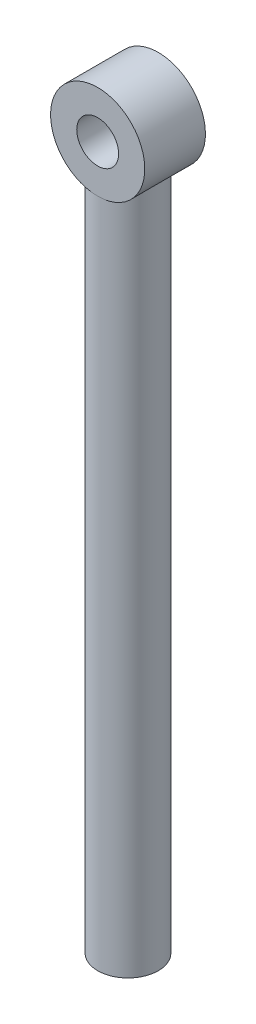
ISO-10303-21;
HEADER;
FILE_DESCRIPTION(('STEP AP214'),'2;1');
FILE_NAME('part.step','',(''),(''),'','','');
FILE_SCHEMA(('AUTOMOTIVE_DESIGN { 1 0 10303 214 1 1 1 1 }'));
ENDSEC;
DATA;
#1=APPLICATION_CONTEXT('core data for automotive mechanical design processes');
#2=APPLICATION_PROTOCOL_DEFINITION('international standard','automotive_design',2000,#1);
#3=PRODUCT_CONTEXT('',#1,'mechanical');
#4=PRODUCT('Part','Part','',(#3));
#5=PRODUCT_RELATED_PRODUCT_CATEGORY('part','',(#4));
#6=PRODUCT_DEFINITION_FORMATION('','',#4);
#7=PRODUCT_DEFINITION_CONTEXT('part definition',#1,'design');
#8=PRODUCT_DEFINITION('design','',#6,#7);
#9=PRODUCT_DEFINITION_SHAPE('','',#8);
#10=(LENGTH_UNIT() NAMED_UNIT(*) SI_UNIT(.MILLI.,.METRE.));
#11=(NAMED_UNIT(*) PLANE_ANGLE_UNIT() SI_UNIT($,.RADIAN.));
#12=(NAMED_UNIT(*) SI_UNIT($,.STERADIAN.) SOLID_ANGLE_UNIT());
#13=UNCERTAINTY_MEASURE_WITH_UNIT(LENGTH_MEASURE(1.E-05),#10,'distance_accuracy_value','');
#14=(GEOMETRIC_REPRESENTATION_CONTEXT(3) GLOBAL_UNCERTAINTY_ASSIGNED_CONTEXT((#13)) GLOBAL_UNIT_ASSIGNED_CONTEXT((#10,
#11,#12)) REPRESENTATION_CONTEXT('',''));
#15=CARTESIAN_POINT('',(0.,0.,0.));
#16=DIRECTION('',(0.,0.,1.));
#17=DIRECTION('',(1.,0.,0.));
#18=AXIS2_PLACEMENT_3D('',#15,#16,#17);
#19=CARTESIAN_POINT('',(0.,137.19,-6.));
#20=DIRECTION('',(0.,0.,1.));
#21=DIRECTION('',(1.,0.,0.));
#22=AXIS2_PLACEMENT_3D('',#19,#20,#21);
#23=CYLINDRICAL_SURFACE('',#22,9.);
#24=CARTESIAN_POINT('',(0.,137.19,-5.795));
#25=DIRECTION('',(0.,0.,1.));
#26=DIRECTION('',(1.,0.,0.));
#27=AXIS2_PLACEMENT_3D('',#24,#25,#26);
#28=CIRCLE('',#27,9.);
#29=CARTESIAN_POINT('',(0.,128.19,-5.795));
#30=VERTEX_POINT('',#29);
#31=EDGE_CURVE('E64',#30,#30,#28,.F.);
#32=ORIENTED_EDGE('',*,*,#31,.F.);
#33=CARTESIAN_POINT('',(0.,128.19,-5.795));
#34=CARTESIAN_POINT('',(0.146566460211935,128.189996163815,-5.79500406610965));
#35=CARTESIAN_POINT('',(0.293094389436088,128.193585808997,-5.78943519676194));
#36=CARTESIAN_POINT('',(0.585010912628849,128.207845530778,-5.76725252388943));
#37=CARTESIAN_POINT('',(0.730399271779798,128.218517029756,-5.75063650155872));
#38=CARTESIAN_POINT('',(1.01893791146239,128.246689656394,-5.70658477809815));
#39=CARTESIAN_POINT('',(1.16208673682949,128.264195047201,-5.67914232306495));
#40=CARTESIAN_POINT('',(1.44508563906381,128.305621006286,-5.61380911613113));
#41=CARTESIAN_POINT('',(1.58493432150189,128.329544235336,-5.57591403048929));
#42=CARTESIAN_POINT('',(1.85965891551648,128.383119292647,-5.49038065346297));
#43=CARTESIAN_POINT('',(1.99455697454925,128.412740565332,-5.44279425490061));
#44=CARTESIAN_POINT('',(2.25943120744945,128.477159818797,-5.33828568017174));
#45=CARTESIAN_POINT('',(2.38940544947583,128.511959805568,-5.28135988548072));
#46=CARTESIAN_POINT('',(2.77087229348116,128.623073537936,-5.09743696545987));
#47=CARTESIAN_POINT('',(3.01416818837551,128.706153610186,-4.95721239249815));
#48=CARTESIAN_POINT('',(3.49390709466027,128.89155234267,-4.63307476649679));
#49=CARTESIAN_POINT('',(3.72814284508117,128.994891061144,-4.4465179766744));
#50=CARTESIAN_POINT('',(4.16423018226008,129.207641650011,-4.04103456261219));
#51=CARTESIAN_POINT('',(4.36603636907035,129.317061750758,-3.82206336896974));
#52=CARTESIAN_POINT('',(4.65565171652341,129.486759145333,-3.45484376078352));
#53=CARTESIAN_POINT('',(4.75535315040896,129.548078058326,-3.31630026094598));
#54=CARTESIAN_POINT('',(4.94265359664025,129.66786360827,-3.03009754810605));
#55=CARTESIAN_POINT('',(5.03025012816019,129.726329658961,-2.88243647545778));
#56=CARTESIAN_POINT('',(5.27357790009867,129.894243505644,-2.42684691303729));
#57=CARTESIAN_POINT('',(5.41043168823586,129.996566846101,-2.10557600934063));
#58=CARTESIAN_POINT('',(5.59624716744369,130.140742319172,-1.52628668717239));
#59=CARTESIAN_POINT('',(5.65899988913766,130.19147565492,-1.27491095137898));
#60=CARTESIAN_POINT('',(5.72762959496277,130.247732873605,-0.890644735579731));
#61=CARTESIAN_POINT('',(5.74625443686519,130.263176429205,-0.761396842354587));
#62=CARTESIAN_POINT('',(5.77476088146397,130.286920966589,-0.501261478201259));
#63=CARTESIAN_POINT('',(5.78464239386718,130.295221874611,-0.370373990354992));
#64=CARTESIAN_POINT('',(5.79549992328461,130.304346205593,-0.107542448493395));
#65=CARTESIAN_POINT('',(5.79644682402809,130.305145181081,0.0244036584390873));
#66=CARTESIAN_POINT('',(5.78934531283242,130.299172600946,0.287879164456985));
#67=CARTESIAN_POINT('',(5.78129685729199,130.292401008626,0.419408561519473));
#68=CARTESIAN_POINT('',(5.75633576327491,130.271556377372,0.681106551360294));
#69=CARTESIAN_POINT('',(5.7394184860462,130.257479517526,0.811274395617237));
#70=CARTESIAN_POINT('',(5.69699384065389,130.222575407119,1.06930347172042));
#71=CARTESIAN_POINT('',(5.67148289186515,130.201745342916,1.19716371865238));
#72=CARTESIAN_POINT('',(5.58448687493165,130.131744103368,1.56795139527387));
#73=CARTESIAN_POINT('',(5.51166176449319,130.074278226842,1.80675731058647));
#74=CARTESIAN_POINT('',(5.33805498475075,129.943143787006,2.26899373419825));
#75=CARTESIAN_POINT('',(5.23726406465388,129.869469863919,2.49241912420707));
#76=CARTESIAN_POINT('',(4.98805793438041,129.696904478514,2.96405721561836));
#77=CARTESIAN_POINT('',(4.83418896469323,129.595896877173,3.20861070641109));
#78=CARTESIAN_POINT('',(4.49291913384385,129.389134642643,3.6712987863816));
#79=CARTESIAN_POINT('',(4.30547822547128,129.283374454323,3.88940129587287));
#80=CARTESIAN_POINT('',(3.98202648069638,129.117709856851,4.21362176794068));
#81=CARTESIAN_POINT('',(3.85602104684325,129.056616720364,4.32926141648315));
#82=CARTESIAN_POINT('',(3.59349471090576,128.937269799221,4.54952312783881));
#83=CARTESIAN_POINT('',(3.45697725038741,128.879015095395,4.65414877023152));
#84=CARTESIAN_POINT('',(3.17404040075722,128.766899781425,4.8515182210462));
#85=CARTESIAN_POINT('',(3.02762695239219,128.713036577089,4.9442690630173));
#86=CARTESIAN_POINT('',(2.72554188804598,128.611141885818,5.11700065329541));
#87=CARTESIAN_POINT('',(2.56987285898514,128.563108780689,5.19698494701825));
#88=CARTESIAN_POINT('',(2.28192041908408,128.483075225029,5.32866999781728));
#89=CARTESIAN_POINT('',(2.15111715814147,128.449783998009,5.38283451004325));
#90=CARTESIAN_POINT('',(1.88480582897197,128.38851352913,5.48176054202909));
#91=CARTESIAN_POINT('',(1.74929869169749,128.360533243185,5.52652391016118));
#92=CARTESIAN_POINT('',(1.47441579298938,128.310495444559,5.60612020221522));
#93=CARTESIAN_POINT('',(1.33504246182657,128.288434300225,5.64095921597647));
#94=CARTESIAN_POINT('',(1.05324965439295,128.250711999137,5.70030000721156));
#95=CARTESIAN_POINT('',(0.910830122929085,128.235050958447,5.72480159721818));
#96=CARTESIAN_POINT('',(0.623471195373022,128.210459371977,5.76319299342244));
#97=CARTESIAN_POINT('',(0.478524677524407,128.201552785911,5.77704502538261));
#98=CARTESIAN_POINT('',(0.18773672365014,128.190782114213,5.79378881428976));
#99=CARTESIAN_POINT('',(0.0418952873021302,128.188918031118,5.79668056728851));
#100=CARTESIAN_POINT('',(-0.249514474181884,128.192279389996,5.79145967493547));
#101=CARTESIAN_POINT('',(-0.395082786184961,128.197505164552,5.78334651334761));
#102=CARTESIAN_POINT('',(-0.684774347379441,128.214915461171,5.75623790598855));
#103=CARTESIAN_POINT('',(-0.828897637023239,128.227099787877,5.7372427657211));
#104=CARTESIAN_POINT('',(-1.10662861507657,128.257263791365,5.69000116931099));
#105=CARTESIAN_POINT('',(-1.2403740587641,128.274881807033,5.66233062568513));
#106=CARTESIAN_POINT('',(-1.50479977836985,128.315682546303,5.59787011058351));
#107=CARTESIAN_POINT('',(-1.6354789880285,128.338867175069,5.56107701678627));
#108=CARTESIAN_POINT('',(-2.02170039666333,128.416092062372,5.43761627521842));
#109=CARTESIAN_POINT('',(-2.27164943812808,128.477828652185,5.33782845512569));
#110=CARTESIAN_POINT('',(-2.769023218433,128.622357482491,5.09865137517513));
#111=CARTESIAN_POINT('',(-3.0149523429355,128.70635138233,4.95691629383646));
#112=CARTESIAN_POINT('',(-3.48068386606001,128.886549095247,4.64177165728695));
#113=CARTESIAN_POINT('',(-3.70046638007826,128.982762087477,4.46833824639162));
#114=CARTESIAN_POINT('',(-4.14327827445386,129.196100193613,4.06428147800318));
#115=CARTESIAN_POINT('',(-4.36161191645123,129.31416622984,3.82896499997568));
#116=CARTESIAN_POINT('',(-4.65825937707268,129.488450166968,3.45084522523887));
#117=CARTESIAN_POINT('',(-4.75204192812729,129.546105953626,3.3205374022702));
#118=CARTESIAN_POINT('',(-4.92890625459751,129.658939605373,3.05185165382301));
#119=CARTESIAN_POINT('',(-5.01198835787395,129.714117546347,2.91347397579301));
#120=CARTESIAN_POINT('',(-5.22418731627669,129.859617078838,2.52371495394658));
#121=CARTESIAN_POINT('',(-5.34200281436601,129.945807337544,2.26433306507069));
#122=CARTESIAN_POINT('',(-5.49010663671462,130.058198642925,1.86046971947333));
#123=CARTESIAN_POINT('',(-5.53470213127286,130.092844532,1.72339564306661));
#124=CARTESIAN_POINT('',(-5.61384828629813,130.155282853292,1.44487259330761));
#125=CARTESIAN_POINT('',(-5.64840400622538,130.183078736435,1.30342586341955));
#126=CARTESIAN_POINT('',(-5.70723337074461,130.230908944326,1.01553987129334));
#127=CARTESIAN_POINT('',(-5.73139687710968,130.250859946452,0.869064085271767));
#128=CARTESIAN_POINT('',(-5.76844866367442,130.281629354826,0.5737292258866));
#129=CARTESIAN_POINT('',(-5.78133726870309,130.292448024174,0.424870221309162));
#130=CARTESIAN_POINT('',(-5.79554894007888,130.304384498585,0.126315519175613));
#131=CARTESIAN_POINT('',(-5.79688028543933,130.305509247858,-0.023379502567964));
#132=CARTESIAN_POINT('',(-5.7879674436291,130.298014311043,-0.322168026546469));
#133=CARTESIAN_POINT('',(-5.77772428201023,130.289395488277,-0.471261580899439));
#134=CARTESIAN_POINT('',(-5.74830234796798,130.26487764578,-0.745008149542937));
#135=CARTESIAN_POINT('',(-5.73070592192043,130.250274054941,-0.869953033347393));
#136=CARTESIAN_POINT('',(-5.68760071418632,130.214903863287,-1.11760163766319));
#137=CARTESIAN_POINT('',(-5.66208969431247,130.194135519197,-1.24030471380161));
#138=CARTESIAN_POINT('',(-5.57413938332963,130.123551861374,-1.60412406148585));
#139=CARTESIAN_POINT('',(-5.50028402349704,130.065458970112,-1.8409397968097));
#140=CARTESIAN_POINT('',(-5.29476019612672,129.910780040999,-2.37833899313743));
#141=CARTESIAN_POINT('',(-5.15194301208655,129.807827001076,-2.67282401118883));
#142=CARTESIAN_POINT('',(-4.90475790834357,129.643262523096,-3.09057838943878));
#143=CARTESIAN_POINT('',(-4.8167462253627,129.586645707605,-3.22597992778944));
#144=CARTESIAN_POINT('',(-4.63013794186146,129.471592659449,-3.48851778504828));
#145=CARTESIAN_POINT('',(-4.53154220738867,129.413156575923,-3.61565477884397));
#146=CARTESIAN_POINT('',(-4.3228759733769,129.29523593493,-3.86280651430476));
#147=CARTESIAN_POINT('',(-4.2126732493201,129.235747608019,-3.98270751350078));
#148=CARTESIAN_POINT('',(-3.98226111384576,129.117928709243,-4.21309328840516));
#149=CARTESIAN_POINT('',(-3.86205230579105,129.059598067832,-4.32357863106191));
#150=CARTESIAN_POINT('',(-3.6120865825215,128.945505050599,-4.5344881944535));
#151=CARTESIAN_POINT('',(-3.48233466942049,128.88974135386,-4.6349176218198));
#152=CARTESIAN_POINT('',(-3.21375810984177,128.782106698474,-4.82502114696768));
#153=CARTESIAN_POINT('',(-3.07493881220026,128.730233482951,-4.91470149865284));
#154=CARTESIAN_POINT('',(-2.80659840266023,128.637774446614,-5.07209211762957));
#155=CARTESIAN_POINT('',(-2.67807262086438,128.596587471748,-5.14114757494923));
#156=CARTESIAN_POINT('',(-2.41505093877621,128.518995584344,-5.26981743378093));
#157=CARTESIAN_POINT('',(-2.2805577338676,128.482588541627,-5.32943604328106));
#158=CARTESIAN_POINT('',(-2.00635517950941,128.415352720425,-5.43859431124456));
#159=CARTESIAN_POINT('',(-1.86665172397629,128.384517856465,-5.48814497254113));
#160=CARTESIAN_POINT('',(-1.5827666133739,128.329087119994,-5.57664662647468));
#161=CARTESIAN_POINT('',(-1.4385860045069,128.304489802052,-5.61560007496384));
#162=CARTESIAN_POINT('',(-1.08224355116925,128.252783252375,-5.69712914174452));
#163=CARTESIAN_POINT('',(-0.868132990483095,128.229346936819,-5.73373130331263));
#164=CARTESIAN_POINT('',(-0.435986717143373,128.197957672644,-5.78266447773596));
#165=CARTESIAN_POINT('',(-0.217950756795001,128.190005704576,-5.79499395351655));
#166=CARTESIAN_POINT('',(0.,128.19,-5.795));
#167=B_SPLINE_CURVE_WITH_KNOTS('',3,(#33,#34,#35,#36,#37,#38,#39,#40,#41,#42,#43,#44,#45,#46,
#47,#48,#49,#50,#51,#52,#53,#54,#55,#56,#57,#58,#59,#60,#61,#62,#63,#64,#65,#66,#67,#68,#69,#70,
#71,#72,#73,#74,#75,#76,#77,#78,#79,#80,#81,#82,#83,#84,#85,#86,#87,#88,#89,#90,#91,#92,#93,#94,
#95,#96,#97,#98,#99,#100,#101,#102,#103,#104,#105,#106,#107,#108,#109,#110,#111,#112,#113,#114,
#115,#116,#117,#118,#119,#120,#121,#122,#123,#124,#125,#126,#127,#128,#129,#130,#131,#132,#133,
#134,#135,#136,#137,#138,#139,#140,#141,#142,#143,#144,#145,#146,#147,#148,#149,#150,#151,#152,
#153,#154,#155,#156,#157,#158,#159,#160,#161,#162,#163,#164,#165,#166),.UNSPECIFIED.,.T.,.F.,(4,
2,2,2,2,2,2,2,2,2,2,2,2,2,2,2,2,2,2,2,2,2,2,2,2,2,2,2,2,2,2,2,2,2,2,2,2,2,2,2,2,2,2,2,2,2,2,2,2,
2,2,2,2,2,2,2,2,2,2,2,2,2,2,2,2,2,4),(0.,0.439484421852275,0.87905714024055,1.31890451402353,
1.75893452674717,2.19666755208976,2.63457057821032,3.50955532276802,4.45646460726089,
5.40468818645085,5.94819370579219,6.49181044859555,7.57606326913175,8.36463810400387,
8.75868070453449,9.15272737433074,9.54805772863484,9.9433899991473,10.338929251013,
10.7346335118813,11.5001000564592,12.2658201117361,13.1808185541027,14.0969158364657,
14.6411776212891,15.1852619699915,15.7290225469503,16.2726318516729,16.708497854619,
17.1442780809426,17.5797903224288,18.0153104615073,18.4523683633979,18.8894264227303,
19.326504984987,19.7635712771771,20.176228321735,20.5890267994281,21.4139480947169,
22.2986508089511,23.1840220994101,24.2055122274497,24.7168089674048,25.2280900375414,
26.1168622560585,26.5611737951575,27.0052610372647,27.4539452709083,27.9026165775698,
28.3509664531453,28.799276606081,29.1799100088427,29.5606511501211,30.3221653766144,
31.3457227522774,31.8587138801935,32.3716630641946,32.8912642027152,33.4108340321619,
33.9301334385608,34.4491292302901,34.9034849856399,35.3576375648105,35.8112911182496,
36.264839449968,36.9183306860263,37.5718633032691),.UNSPECIFIED.);
#168=CARTESIAN_POINT('',(0.,128.19,5.795));
#169=VERTEX_POINT('',#168);
#170=EDGE_CURVE('E50',#169,#30,#167,.T.);
#171=ORIENTED_EDGE('',*,*,#170,.F.);
#172=CARTESIAN_POINT('',(0.,137.19,5.795));
#173=DIRECTION('',(0.,0.,-1.));
#174=DIRECTION('',(-1.,0.,0.));
#175=AXIS2_PLACEMENT_3D('',#172,#173,#174);
#176=CIRCLE('',#175,9.);
#177=EDGE_CURVE('E73',#169,#169,#176,.F.);
#178=ORIENTED_EDGE('',*,*,#177,.F.);
#179=EDGE_CURVE('E68',#30,#169,#167,.T.);
#180=ORIENTED_EDGE('',*,*,#179,.F.);
#181=EDGE_LOOP('',(#32,#171,#178,#180));
#182=FACE_BOUND('',#181,.T.);
#183=ADVANCED_FACE('F45',(#182),#23,.T.);
#184=CARTESIAN_POINT('',(0.,137.19,-6.));
#185=DIRECTION('',(0.,0.,1.));
#186=DIRECTION('',(1.,0.,0.));
#187=AXIS2_PLACEMENT_3D('',#184,#185,#186);
#188=CYLINDRICAL_SURFACE('',#187,4.);
#189=CARTESIAN_POINT('',(0.,137.19,-5.795));
#190=DIRECTION('',(0.,0.,1.));
#191=DIRECTION('',(1.,0.,0.));
#192=AXIS2_PLACEMENT_3D('',#189,#190,#191);
#193=CIRCLE('',#192,4.);
#194=CARTESIAN_POINT('',(4.,137.19,-5.795));
#195=VERTEX_POINT('',#194);
#196=EDGE_CURVE('E76',#195,#195,#193,.F.);
#197=ORIENTED_EDGE('',*,*,#196,.T.);
#198=EDGE_LOOP('',(#197));
#199=FACE_BOUND('',#198,.T.);
#200=CARTESIAN_POINT('',(0.,137.19,5.795));
#201=DIRECTION('',(0.,0.,-1.));
#202=DIRECTION('',(-1.,0.,0.));
#203=AXIS2_PLACEMENT_3D('',#200,#201,#202);
#204=CIRCLE('',#203,4.);
#205=CARTESIAN_POINT('',(-4.,137.19,5.795));
#206=VERTEX_POINT('',#205);
#207=EDGE_CURVE('E71',#206,#206,#204,.F.);
#208=ORIENTED_EDGE('',*,*,#207,.T.);
#209=EDGE_LOOP('',(#208));
#210=FACE_BOUND('',#209,.T.);
#211=ADVANCED_FACE('F90',(#199,#210),#188,.F.);
#212=CARTESIAN_POINT('',(0.,132.19,0.));
#213=DIRECTION('',(0.,-1.,0.));
#214=DIRECTION('',(0.,0.,-1.));
#215=AXIS2_PLACEMENT_3D('',#212,#213,#214);
#216=CYLINDRICAL_SURFACE('',#215,5.795);
#217=CARTESIAN_POINT('',(0.,0.,0.));
#218=DIRECTION('',(0.,1.,0.));
#219=DIRECTION('',(0.,0.,1.));
#220=AXIS2_PLACEMENT_3D('',#217,#218,#219);
#221=CIRCLE('',#220,5.795);
#222=CARTESIAN_POINT('',(0.,0.,5.795));
#223=VERTEX_POINT('',#222);
#224=EDGE_CURVE('E12',#223,#223,#221,.T.);
#225=ORIENTED_EDGE('',*,*,#224,.T.);
#226=EDGE_LOOP('',(#225));
#227=FACE_BOUND('',#226,.T.);
#228=ORIENTED_EDGE('',*,*,#170,.T.);
#229=ORIENTED_EDGE('',*,*,#179,.T.);
#230=EDGE_LOOP('',(#228,#229));
#231=FACE_BOUND('',#230,.T.);
#232=ADVANCED_FACE('F47',(#227,#231),#216,.T.);
#233=CARTESIAN_POINT('',(0.,0.,0.));
#234=DIRECTION('',(0.,1.,0.));
#235=DIRECTION('',(0.,0.,1.));
#236=AXIS2_PLACEMENT_3D('',#233,#234,#235);
#237=PLANE('',#236);
#238=ORIENTED_EDGE('',*,*,#224,.F.);
#239=EDGE_LOOP('',(#238));
#240=FACE_BOUND('',#239,.T.);
#241=ADVANCED_FACE('F96',(#240),#237,.F.);
#242=CARTESIAN_POINT('',(0.,169.19,5.795));
#243=DIRECTION('',(0.,0.,-1.));
#244=DIRECTION('',(-1.,0.,0.));
#245=AXIS2_PLACEMENT_3D('',#242,#243,#244);
#246=PLANE('',#245);
#247=ORIENTED_EDGE('',*,*,#177,.T.);
#248=EDGE_LOOP('',(#247));
#249=FACE_BOUND('',#248,.T.);
#250=ORIENTED_EDGE('',*,*,#207,.F.);
#251=EDGE_LOOP('',(#250));
#252=FACE_BOUND('',#251,.T.);
#253=ADVANCED_FACE('F74',(#249,#252),#246,.F.);
#254=CARTESIAN_POINT('',(0.,146.19,-5.795));
#255=DIRECTION('',(0.,0.,1.));
#256=DIRECTION('',(1.,0.,0.));
#257=AXIS2_PLACEMENT_3D('',#254,#255,#256);
#258=PLANE('',#257);
#259=ORIENTED_EDGE('',*,*,#31,.T.);
#260=EDGE_LOOP('',(#259));
#261=FACE_BOUND('',#260,.T.);
#262=ORIENTED_EDGE('',*,*,#196,.F.);
#263=EDGE_LOOP('',(#262));
#264=FACE_BOUND('',#263,.T.);
#265=ADVANCED_FACE('F84',(#261,#264),#258,.F.);
#266=CLOSED_SHELL('',(#183,#211,#232,#241,#253,#265));
#267=MANIFOLD_SOLID_BREP('B2',#266);
#268=ADVANCED_BREP_SHAPE_REPRESENTATION('',(#18,#267),#14);
#269=SHAPE_DEFINITION_REPRESENTATION(#9,#268);
ENDSEC;
END-ISO-10303-21;
